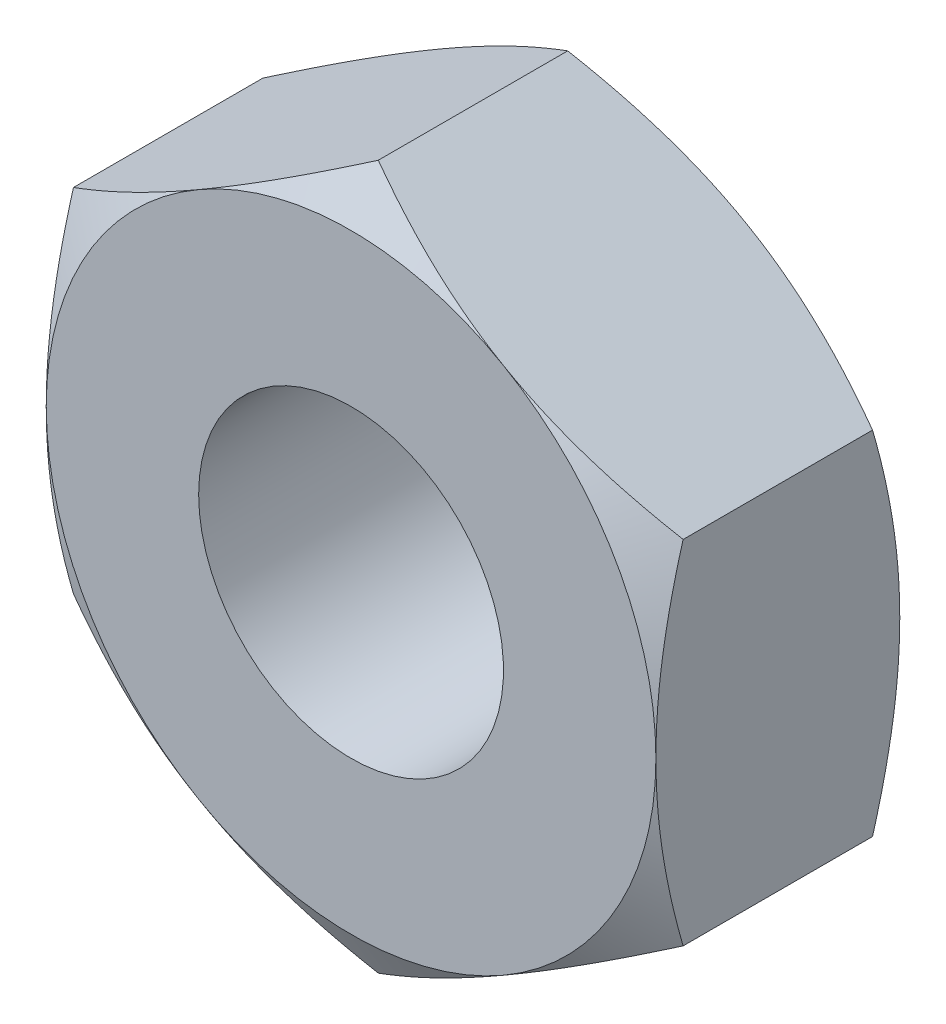
ISO-10303-21;
HEADER;
FILE_DESCRIPTION(('STEP AP214'),'2;1');
FILE_NAME('part.step','',(''),(''),'','','');
FILE_SCHEMA(('AUTOMOTIVE_DESIGN { 1 0 10303 214 1 1 1 1 }'));
ENDSEC;
DATA;
#1=APPLICATION_CONTEXT('core data for automotive mechanical design processes');
#2=APPLICATION_PROTOCOL_DEFINITION('international standard','automotive_design',2000,#1);
#3=PRODUCT_CONTEXT('',#1,'mechanical');
#4=PRODUCT('Part','Part','',(#3));
#5=PRODUCT_RELATED_PRODUCT_CATEGORY('part','',(#4));
#6=PRODUCT_DEFINITION_FORMATION('','',#4);
#7=PRODUCT_DEFINITION_CONTEXT('part definition',#1,'design');
#8=PRODUCT_DEFINITION('design','',#6,#7);
#9=PRODUCT_DEFINITION_SHAPE('','',#8);
#10=(LENGTH_UNIT() NAMED_UNIT(*) SI_UNIT(.MILLI.,.METRE.));
#11=(NAMED_UNIT(*) PLANE_ANGLE_UNIT() SI_UNIT($,.RADIAN.));
#12=(NAMED_UNIT(*) SI_UNIT($,.STERADIAN.) SOLID_ANGLE_UNIT());
#13=UNCERTAINTY_MEASURE_WITH_UNIT(LENGTH_MEASURE(1.E-05),#10,'distance_accuracy_value','');
#14=(GEOMETRIC_REPRESENTATION_CONTEXT(3) GLOBAL_UNCERTAINTY_ASSIGNED_CONTEXT((#13)) GLOBAL_UNIT_ASSIGNED_CONTEXT((#10,
#11,#12)) REPRESENTATION_CONTEXT('',''));
#15=CARTESIAN_POINT('',(0.,0.,0.));
#16=DIRECTION('',(0.,0.,1.));
#17=DIRECTION('',(1.,0.,0.));
#18=AXIS2_PLACEMENT_3D('',#15,#16,#17);
#19=CARTESIAN_POINT('',(0.,2.3094010767585,0.8));
#20=DIRECTION('',(0.5,-0.866025403784438,0.));
#21=DIRECTION('',(0.866025403784439,0.5,0.));
#22=AXIS2_PLACEMENT_3D('',#19,#20,#21);
#23=PLANE('',#22);
#24=DIRECTION('',(0.,0.,-1.));
#25=VECTOR('',#24,1.);
#26=CARTESIAN_POINT('',(0.,2.3094010767585,0.8));
#27=LINE('',#26,#25);
#28=CARTESIAN_POINT('',(0.,2.3094010767585,0.621367205045919));
#29=VERTEX_POINT('',#28);
#30=CARTESIAN_POINT('',(0.,2.3094010767585,-0.621367205045919));
#31=VERTEX_POINT('',#30);
#32=EDGE_CURVE('E243',#29,#31,#27,.T.);
#33=ORIENTED_EDGE('',*,*,#32,.T.);
#34=CARTESIAN_POINT('',(0.000199999999999798,2.30951654681234,-0.621300533379502));
#35=CARTESIAN_POINT('',(-0.0876912629000602,2.25877250251758,-0.650610463899321));
#36=CARTESIAN_POINT('',(-0.176341194473591,2.20759044065996,-0.677267148019533));
#37=CARTESIAN_POINT('',(-0.355176246997802,2.10433997494456,-0.723797508979279));
#38=CARTESIAN_POINT('',(-0.445364546505036,2.0522697359463,-0.743654723617221));
#39=CARTESIAN_POINT('',(-0.624623385763306,1.94877459684592,-0.774566535976747));
#40=CARTESIAN_POINT('',(-0.713666338226304,1.89736562427197,-0.785826848401469));
#41=CARTESIAN_POINT('',(-0.892171397785043,1.79430568008402,-0.799271337405358));
#42=CARTESIAN_POINT('',(-0.981632855703958,1.74265508327244,-0.801466645046532));
#43=CARTESIAN_POINT('',(-1.1488083535488,1.64613626458981,-0.796909010669351));
#44=CARTESIAN_POINT('',(-1.22654737026578,1.60125362236172,-0.791275125312985));
#45=CARTESIAN_POINT('',(-1.38151891453613,1.51178075956051,-0.773416104739172));
#46=CARTESIAN_POINT('',(-1.4587509057412,1.46719084864821,-0.761184863976561));
#47=CARTESIAN_POINT('',(-1.6140421864822,1.37753338590959,-0.73060656313239));
#48=CARTESIAN_POINT('',(-1.69208181310738,1.33247718647009,-0.712129832934284));
#49=CARTESIAN_POINT('',(-1.84699686569213,1.24303693915875,-0.670194481787144));
#50=CARTESIAN_POINT('',(-1.92387427762312,1.1986517446858,-0.646745719507687));
#51=CARTESIAN_POINT('',(-2.0002,1.15458506832541,-0.621300533379503));
#52=B_SPLINE_CURVE_WITH_KNOTS('',3,(#34,#35,#36,#37,#38,#39,#40,#41,#42,#43,#44,#45,#46,#47,#48,
#49,#50,#51),.UNSPECIFIED.,.F.,.F.,(4,2,2,2,2,2,2,2,4),(0.,0.31703182469561,0.634825876346563,
0.944753967652636,1.25430138000371,1.52387047293094,1.79368946861028,2.06949491027634,
2.34475850821472),.UNSPECIFIED.);
#53=CARTESIAN_POINT('',(-1.,1.73205080756888,-0.8));
#54=VERTEX_POINT('',#53);
#55=EDGE_CURVE('E60',#31,#54,#52,.T.);
#56=ORIENTED_EDGE('',*,*,#55,.T.);
#57=CARTESIAN_POINT('',(-2.,1.15470053837925,-0.621367205045919));
#58=VERTEX_POINT('',#57);
#59=EDGE_CURVE('E178',#54,#58,#52,.T.);
#60=ORIENTED_EDGE('',*,*,#59,.T.);
#61=DIRECTION('',(0.,0.,-1.));
#62=VECTOR('',#61,1.);
#63=CARTESIAN_POINT('',(-2.,1.15470053837925,0.8));
#64=LINE('',#63,#62);
#65=CARTESIAN_POINT('',(-2.,1.15470053837925,0.621367205045919));
#66=VERTEX_POINT('',#65);
#67=EDGE_CURVE('E258',#66,#58,#64,.T.);
#68=ORIENTED_EDGE('',*,*,#67,.F.);
#69=CARTESIAN_POINT('',(0.000199999999999798,2.30951654681234,0.621300533379502));
#70=CARTESIAN_POINT('',(-0.0876912629000602,2.25877250251758,0.650610463899321));
#71=CARTESIAN_POINT('',(-0.176341194473591,2.20759044065996,0.677267148019533));
#72=CARTESIAN_POINT('',(-0.355176246997802,2.10433997494456,0.723797508979279));
#73=CARTESIAN_POINT('',(-0.445364546505036,2.0522697359463,0.743654723617221));
#74=CARTESIAN_POINT('',(-0.624623385763306,1.94877459684592,0.774566535976747));
#75=CARTESIAN_POINT('',(-0.713666338226304,1.89736562427197,0.785826848401469));
#76=CARTESIAN_POINT('',(-0.892171397785043,1.79430568008402,0.799271337405358));
#77=CARTESIAN_POINT('',(-0.981632855703958,1.74265508327244,0.801466645046532));
#78=CARTESIAN_POINT('',(-1.1488083535488,1.64613626458981,0.796909010669351));
#79=CARTESIAN_POINT('',(-1.22654737026578,1.60125362236172,0.791275125312985));
#80=CARTESIAN_POINT('',(-1.38151891453613,1.51178075956051,0.773416104739172));
#81=CARTESIAN_POINT('',(-1.4587509057412,1.46719084864821,0.761184863976561));
#82=CARTESIAN_POINT('',(-1.6140421864822,1.37753338590959,0.73060656313239));
#83=CARTESIAN_POINT('',(-1.69208181310738,1.33247718647009,0.712129832934284));
#84=CARTESIAN_POINT('',(-1.84699686569213,1.24303693915875,0.670194481787144));
#85=CARTESIAN_POINT('',(-1.92387427762312,1.1986517446858,0.646745719507687));
#86=CARTESIAN_POINT('',(-2.0002,1.15458506832541,0.621300533379503));
#87=B_SPLINE_CURVE_WITH_KNOTS('',3,(#69,#70,#71,#72,#73,#74,#75,#76,#77,#78,#79,#80,#81,#82,#83,
#84,#85,#86),.UNSPECIFIED.,.F.,.F.,(4,2,2,2,2,2,2,2,4),(0.,0.31703182469561,0.634825876346563,
0.944753967652636,1.25430138000371,1.52387047293094,1.79368946861028,2.06949491027634,
2.34475850821472),.UNSPECIFIED.);
#88=CARTESIAN_POINT('',(-1.,1.73205080756888,0.8));
#89=VERTEX_POINT('',#88);
#90=EDGE_CURVE('E234',#89,#66,#87,.T.);
#91=ORIENTED_EDGE('',*,*,#90,.F.);
#92=EDGE_CURVE('E239',#29,#89,#87,.T.);
#93=ORIENTED_EDGE('',*,*,#92,.F.);
#94=EDGE_LOOP('',(#33,#56,#60,#68,#91,#93));
#95=FACE_BOUND('',#94,.T.);
#96=ADVANCED_FACE('F38',(#95),#23,.F.);
#97=CARTESIAN_POINT('',(-2.,1.15470053837925,0.8));
#98=DIRECTION('',(1.,0.,0.));
#99=DIRECTION('',(0.,0.,-1.));
#100=AXIS2_PLACEMENT_3D('',#97,#98,#99);
#101=PLANE('',#100);
#102=ORIENTED_EDGE('',*,*,#67,.T.);
#103=CARTESIAN_POINT('',(-2.,-3.14946280755068,0.199296983759909));
#104=CARTESIAN_POINT('',(-2.,-3.06168654922102,0.156527633574789));
#105=CARTESIAN_POINT('',(-2.,-2.9737138337997,0.114154813917838));
#106=CARTESIAN_POINT('',(-2.,-2.79727116970519,0.030424371454318));
#107=CARTESIAN_POINT('',(-2.,-2.70880114935967,-0.0109331001558542));
#108=CARTESIAN_POINT('',(-2.,-2.53082636976171,-0.0926086106809137));
#109=CARTESIAN_POINT('',(-2.,-2.44131862529228,-0.132920166328585));
#110=CARTESIAN_POINT('',(-2.,-2.2616076272172,-0.211955914656171));
#111=CARTESIAN_POINT('',(-2.,-2.17140440536949,-0.250680179313292));
#112=CARTESIAN_POINT('',(-2.,-1.98708288008165,-0.327404252129081));
#113=CARTESIAN_POINT('',(-2.,-1.89293561513795,-0.365334850952447));
#114=CARTESIAN_POINT('',(-2.,-1.70357591703192,-0.43843181928538));
#115=CARTESIAN_POINT('',(-2.,-1.60836357685199,-0.473598427976315));
#116=CARTESIAN_POINT('',(-2.,-1.41685790895819,-0.540290890905273));
#117=CARTESIAN_POINT('',(-2.,-1.320566911767,-0.57182337201251));
#118=CARTESIAN_POINT('',(-2.,-1.12660452014373,-0.630263659771523));
#119=CARTESIAN_POINT('',(-2.,-1.02893355536647,-0.657172872979496));
#120=CARTESIAN_POINT('',(-2.,-0.832695758594131,-0.704964094758886));
#121=CARTESIAN_POINT('',(-2.,-0.734137289636661,-0.725879820646293));
#122=CARTESIAN_POINT('',(-2.,-0.535747119692847,-0.760533678381679));
#123=CARTESIAN_POINT('',(-2.,-0.435915558376126,-0.774272590767447));
#124=CARTESIAN_POINT('',(-2.,-0.236796947507614,-0.793295884851828));
#125=CARTESIAN_POINT('',(-2.,-0.137520950727669,-0.798692682024138));
#126=CARTESIAN_POINT('',(-2.,0.0611248179394518,-0.800886152746221));
#127=CARTESIAN_POINT('',(-2.,0.16049459118763,-0.797682699498088));
#128=CARTESIAN_POINT('',(-2.,0.39605143432105,-0.780167134410027));
#129=CARTESIAN_POINT('',(-2.,0.531962961475725,-0.76211500356186));
#130=CARTESIAN_POINT('',(-2.,0.80140273308676,-0.712957702638607));
#131=CARTESIAN_POINT('',(-2.,0.934928711498219,-0.681840744950384));
#132=CARTESIAN_POINT('',(-2.,1.20240583468696,-0.60915176800854));
#133=CARTESIAN_POINT('',(-2.,1.33629332548302,-0.567351384200116));
#134=CARTESIAN_POINT('',(-2.,1.53524627173162,-0.499348947851221));
#135=CARTESIAN_POINT('',(-2.,1.60124601940686,-0.475799779778384));
#136=CARTESIAN_POINT('',(-2.,1.73269428220977,-0.427210441126342));
#137=CARTESIAN_POINT('',(-2.,1.79814280996152,-0.402170304799949));
#138=CARTESIAN_POINT('',(-2.,1.97439415181046,-0.332807074194357));
#139=CARTESIAN_POINT('',(-2.,2.08473168532286,-0.287304517647802));
#140=CARTESIAN_POINT('',(-2.,2.30426835470115,-0.193621613740496));
#141=CARTESIAN_POINT('',(-2.,2.41346736638969,-0.14544097783896));
#142=CARTESIAN_POINT('',(-2.,2.63098527942082,-0.0470392184536771));
#143=CARTESIAN_POINT('',(-2.,2.73930385715561,0.00318261789643134));
#144=CARTESIAN_POINT('',(-2.,2.95520524950209,0.105186581117957));
#145=CARTESIAN_POINT('',(-2.,3.06278804153026,0.156968755619608));
#146=CARTESIAN_POINT('',(-2.,3.38499028481645,0.314286397889381));
#147=CARTESIAN_POINT('',(-2.,3.59872280328008,0.421635968339488));
#148=CARTESIAN_POINT('',(-2.,4.02457125625417,0.639362411589059));
#149=CARTESIAN_POINT('',(-2.,4.23668752151103,0.749738642533589));
#150=CARTESIAN_POINT('',(-2.,4.63740849005678,0.960750287234702));
#151=CARTESIAN_POINT('',(-2.,4.82612256813429,1.06117835067173));
#152=CARTESIAN_POINT('',(-2.,5.20291659711028,1.26324301092442));
#153=CARTESIAN_POINT('',(-2.,5.39099650789844,1.36487968240862));
#154=CARTESIAN_POINT('',(-2.,5.76603621826712,1.56870541402304));
#155=CARTESIAN_POINT('',(-2.,5.95299765701286,1.67089146165099));
#156=CARTESIAN_POINT('',(-2.,6.32652448829288,1.87595012800608));
#157=CARTESIAN_POINT('',(-2.,6.51308991107919,1.97882269160472));
#158=CARTESIAN_POINT('',(-2.,6.69951629242091,2.08194487385819));
#159=B_SPLINE_CURVE_WITH_KNOTS('',3,(#103,#104,#105,#106,#107,#108,#109,#110,#111,#112,#113,
#114,#115,#116,#117,#118,#119,#120,#121,#122,#123,#124,#125,#126,#127,#128,#129,#130,#131,#132,
#133,#134,#135,#136,#137,#138,#139,#140,#141,#142,#143,#144,#145,#146,#147,#148,#149,#150,#151,
#152,#153,#154,#155,#156,#157,#158),.UNSPECIFIED.,.F.,.F.,(4,2,2,2,2,2,2,2,2,2,2,2,2,2,2,2,2,2,
2,2,2,2,2,2,2,2,2,4),(0.,0.292928260881487,0.585899880597929,0.880386954426177,1.17486065965382,
1.47933002200259,1.78377300807745,2.08765174859075,2.39143787445936,2.69347985595588,
2.99548898104746,3.29339171616201,3.59129884343364,4.00176919714359,4.4126106922864,
4.83310033596865,5.04331380141562,5.25352243937825,5.6115261819389,5.96956857147549,
6.32773709623028,6.68591656538681,7.40340089318721,8.12073422530671,8.76204652808672,
9.40339865953487,10.0425911580078,10.6817329313965),.UNSPECIFIED.);
#160=CARTESIAN_POINT('',(-2.,0.,-0.8));
#161=VERTEX_POINT('',#160);
#162=EDGE_CURVE('E326',#58,#161,#159,.F.);
#163=ORIENTED_EDGE('',*,*,#162,.T.);
#164=CARTESIAN_POINT('',(-2.,-1.15470053837925,-0.621367205045919));
#165=VERTEX_POINT('',#164);
#166=EDGE_CURVE('E201',#161,#165,#159,.F.);
#167=ORIENTED_EDGE('',*,*,#166,.T.);
#168=DIRECTION('',(0.,0.,-1.));
#169=VECTOR('',#168,1.);
#170=CARTESIAN_POINT('',(-2.,-1.15470053837925,0.8));
#171=LINE('',#170,#169);
#172=CARTESIAN_POINT('',(-2.,-1.15470053837925,0.621367205045919));
#173=VERTEX_POINT('',#172);
#174=EDGE_CURVE('E255',#173,#165,#171,.T.);
#175=ORIENTED_EDGE('',*,*,#174,.F.);
#176=CARTESIAN_POINT('',(-2.,-3.14946280755068,-0.199296983759909));
#177=CARTESIAN_POINT('',(-2.,-3.06168654922102,-0.156527633574789));
#178=CARTESIAN_POINT('',(-2.,-2.9737138337997,-0.114154813917838));
#179=CARTESIAN_POINT('',(-2.,-2.79727116970519,-0.030424371454318));
#180=CARTESIAN_POINT('',(-2.,-2.70880114935967,0.0109331001558542));
#181=CARTESIAN_POINT('',(-2.,-2.53082636976171,0.0926086106809137));
#182=CARTESIAN_POINT('',(-2.,-2.44131862529228,0.132920166328585));
#183=CARTESIAN_POINT('',(-2.,-2.2616076272172,0.211955914656171));
#184=CARTESIAN_POINT('',(-2.,-2.17140440536949,0.250680179313292));
#185=CARTESIAN_POINT('',(-2.,-1.98708288008165,0.327404252129081));
#186=CARTESIAN_POINT('',(-2.,-1.89293561513795,0.365334850952447));
#187=CARTESIAN_POINT('',(-2.,-1.70357591703192,0.43843181928538));
#188=CARTESIAN_POINT('',(-2.,-1.60836357685199,0.473598427976315));
#189=CARTESIAN_POINT('',(-2.,-1.41685790895819,0.540290890905273));
#190=CARTESIAN_POINT('',(-2.,-1.320566911767,0.57182337201251));
#191=CARTESIAN_POINT('',(-2.,-1.12660452014373,0.630263659771523));
#192=CARTESIAN_POINT('',(-2.,-1.02893355536647,0.657172872979496));
#193=CARTESIAN_POINT('',(-2.,-0.832695758594131,0.704964094758886));
#194=CARTESIAN_POINT('',(-2.,-0.734137289636661,0.725879820646293));
#195=CARTESIAN_POINT('',(-2.,-0.535747119692847,0.760533678381679));
#196=CARTESIAN_POINT('',(-2.,-0.435915558376126,0.774272590767447));
#197=CARTESIAN_POINT('',(-2.,-0.236796947507614,0.793295884851828));
#198=CARTESIAN_POINT('',(-2.,-0.137520950727669,0.798692682024138));
#199=CARTESIAN_POINT('',(-2.,0.0611248179394518,0.800886152746221));
#200=CARTESIAN_POINT('',(-2.,0.16049459118763,0.797682699498088));
#201=CARTESIAN_POINT('',(-2.,0.39605143432105,0.780167134410027));
#202=CARTESIAN_POINT('',(-2.,0.531962961475725,0.76211500356186));
#203=CARTESIAN_POINT('',(-2.,0.80140273308676,0.712957702638607));
#204=CARTESIAN_POINT('',(-2.,0.934928711498219,0.681840744950384));
#205=CARTESIAN_POINT('',(-2.,1.20240583468696,0.60915176800854));
#206=CARTESIAN_POINT('',(-2.,1.33629332548302,0.567351384200116));
#207=CARTESIAN_POINT('',(-2.,1.53524627173162,0.499348947851221));
#208=CARTESIAN_POINT('',(-2.,1.60124601940686,0.475799779778384));
#209=CARTESIAN_POINT('',(-2.,1.73269428220977,0.427210441126342));
#210=CARTESIAN_POINT('',(-2.,1.79814280996152,0.402170304799949));
#211=CARTESIAN_POINT('',(-2.,1.97439415181046,0.332807074194357));
#212=CARTESIAN_POINT('',(-2.,2.08473168532286,0.287304517647802));
#213=CARTESIAN_POINT('',(-2.,2.30426835470115,0.193621613740496));
#214=CARTESIAN_POINT('',(-2.,2.41346736638969,0.14544097783896));
#215=CARTESIAN_POINT('',(-2.,2.63098527942082,0.0470392184536771));
#216=CARTESIAN_POINT('',(-2.,2.73930385715561,-0.00318261789643134));
#217=CARTESIAN_POINT('',(-2.,2.95520524950209,-0.105186581117957));
#218=CARTESIAN_POINT('',(-2.,3.06278804153026,-0.156968755619608));
#219=CARTESIAN_POINT('',(-2.,3.38499028481645,-0.314286397889381));
#220=CARTESIAN_POINT('',(-2.,3.59872280328008,-0.421635968339488));
#221=CARTESIAN_POINT('',(-2.,4.02457125625417,-0.639362411589059));
#222=CARTESIAN_POINT('',(-2.,4.23668752151103,-0.749738642533589));
#223=CARTESIAN_POINT('',(-2.,4.63740849005678,-0.960750287234702));
#224=CARTESIAN_POINT('',(-2.,4.82612256813429,-1.06117835067173));
#225=CARTESIAN_POINT('',(-2.,5.20291659711028,-1.26324301092442));
#226=CARTESIAN_POINT('',(-2.,5.39099650789844,-1.36487968240862));
#227=CARTESIAN_POINT('',(-2.,5.76603621826712,-1.56870541402304));
#228=CARTESIAN_POINT('',(-2.,5.95299765701286,-1.67089146165099));
#229=CARTESIAN_POINT('',(-2.,6.32652448829288,-1.87595012800608));
#230=CARTESIAN_POINT('',(-2.,6.51308991107919,-1.97882269160472));
#231=CARTESIAN_POINT('',(-2.,6.69951629242091,-2.08194487385819));
#232=B_SPLINE_CURVE_WITH_KNOTS('',3,(#176,#177,#178,#179,#180,#181,#182,#183,#184,#185,#186,
#187,#188,#189,#190,#191,#192,#193,#194,#195,#196,#197,#198,#199,#200,#201,#202,#203,#204,#205,
#206,#207,#208,#209,#210,#211,#212,#213,#214,#215,#216,#217,#218,#219,#220,#221,#222,#223,#224,
#225,#226,#227,#228,#229,#230,#231),.UNSPECIFIED.,.F.,.F.,(4,2,2,2,2,2,2,2,2,2,2,2,2,2,2,2,2,2,
2,2,2,2,2,2,2,2,2,4),(0.,0.292928260881487,0.585899880597929,0.880386954426177,1.17486065965382,
1.47933002200259,1.78377300807745,2.08765174859075,2.39143787445936,2.69347985595588,
2.99548898104746,3.29339171616201,3.59129884343364,4.00176919714359,4.4126106922864,
4.83310033596865,5.04331380141562,5.25352243937825,5.6115261819389,5.96956857147549,
6.32773709623028,6.68591656538681,7.40340089318721,8.12073422530671,8.76204652808672,
9.40339865953487,10.0425911580078,10.6817329313965),.UNSPECIFIED.);
#233=CARTESIAN_POINT('',(-2.,0.,0.8));
#234=VERTEX_POINT('',#233);
#235=EDGE_CURVE('E228',#234,#173,#232,.F.);
#236=ORIENTED_EDGE('',*,*,#235,.F.);
#237=EDGE_CURVE('E233',#66,#234,#232,.F.);
#238=ORIENTED_EDGE('',*,*,#237,.F.);
#239=EDGE_LOOP('',(#102,#163,#167,#175,#236,#238));
#240=FACE_BOUND('',#239,.T.);
#241=ADVANCED_FACE('F209',(#240),#101,.F.);
#242=CARTESIAN_POINT('',(-2.,-1.15470053837925,0.8));
#243=DIRECTION('',(0.5,0.866025403784439,0.));
#244=DIRECTION('',(-0.866025403784439,0.5,0.));
#245=AXIS2_PLACEMENT_3D('',#242,#243,#244);
#246=PLANE('',#245);
#247=ORIENTED_EDGE('',*,*,#174,.T.);
#248=CARTESIAN_POINT('',(-2.0002,-1.15458506832541,-0.621300533379502));
#249=CARTESIAN_POINT('',(-1.91230873709994,-1.20532911262018,-0.650610463899321));
#250=CARTESIAN_POINT('',(-1.82365880552641,-1.2565111744778,-0.677267148019533));
#251=CARTESIAN_POINT('',(-1.6448237530022,-1.35976164019319,-0.723797508979279));
#252=CARTESIAN_POINT('',(-1.55463545349496,-1.41183187919145,-0.743654723617221));
#253=CARTESIAN_POINT('',(-1.37537661423669,-1.51532701829183,-0.774566535976747));
#254=CARTESIAN_POINT('',(-1.2863336617737,-1.56673599086578,-0.785826848401469));
#255=CARTESIAN_POINT('',(-1.10782860221496,-1.66979593505373,-0.799271337405358));
#256=CARTESIAN_POINT('',(-1.01836714429604,-1.72144653186531,-0.801466645046532));
#257=CARTESIAN_POINT('',(-0.851191646451202,-1.81796535054794,-0.796909010669351));
#258=CARTESIAN_POINT('',(-0.773452629734216,-1.86284799277603,-0.791275125312985));
#259=CARTESIAN_POINT('',(-0.618481085463866,-1.95232085557725,-0.773416104739171));
#260=CARTESIAN_POINT('',(-0.541249094258801,-1.99691076648954,-0.76118486397656));
#261=CARTESIAN_POINT('',(-0.385957813517799,-2.08656822922816,-0.73060656313239));
#262=CARTESIAN_POINT('',(-0.30791818689262,-2.13162442866767,-0.712129832934284));
#263=CARTESIAN_POINT('',(-0.153003134307864,-2.221064675979,-0.670194481787144));
#264=CARTESIAN_POINT('',(-0.076125722376879,-2.26544987045196,-0.646745719507687));
#265=CARTESIAN_POINT('',(0.000200000000001062,-2.30951654681234,-0.621300533379502));
#266=B_SPLINE_CURVE_WITH_KNOTS('',3,(#248,#249,#250,#251,#252,#253,#254,#255,#256,#257,#258,
#259,#260,#261,#262,#263,#264,#265),.UNSPECIFIED.,.F.,.F.,(4,2,2,2,2,2,2,2,4),(0.,
0.31703182469561,0.634825876346563,0.944753967652636,1.25430138000371,1.52387047293094,
1.79368946861028,2.06949491027634,2.34475850821472),.UNSPECIFIED.);
#267=CARTESIAN_POINT('',(-1.,-1.73205080756888,-0.8));
#268=VERTEX_POINT('',#267);
#269=EDGE_CURVE('E199',#165,#268,#266,.T.);
#270=ORIENTED_EDGE('',*,*,#269,.T.);
#271=CARTESIAN_POINT('',(0.,-2.3094010767585,-0.621367205045919));
#272=VERTEX_POINT('',#271);
#273=EDGE_CURVE('E193',#268,#272,#266,.T.);
#274=ORIENTED_EDGE('',*,*,#273,.T.);
#275=DIRECTION('',(0.,0.,-1.));
#276=VECTOR('',#275,1.);
#277=CARTESIAN_POINT('',(0.,-2.3094010767585,0.8));
#278=LINE('',#277,#276);
#279=CARTESIAN_POINT('',(0.,-2.3094010767585,0.621367205045919));
#280=VERTEX_POINT('',#279);
#281=EDGE_CURVE('E252',#280,#272,#278,.T.);
#282=ORIENTED_EDGE('',*,*,#281,.F.);
#283=CARTESIAN_POINT('',(-2.0002,-1.15458506832541,0.621300533379502));
#284=CARTESIAN_POINT('',(-1.91230873709994,-1.20532911262018,0.650610463899321));
#285=CARTESIAN_POINT('',(-1.82365880552641,-1.2565111744778,0.677267148019533));
#286=CARTESIAN_POINT('',(-1.6448237530022,-1.35976164019319,0.723797508979279));
#287=CARTESIAN_POINT('',(-1.55463545349496,-1.41183187919145,0.743654723617221));
#288=CARTESIAN_POINT('',(-1.37537661423669,-1.51532701829183,0.774566535976747));
#289=CARTESIAN_POINT('',(-1.2863336617737,-1.56673599086578,0.785826848401469));
#290=CARTESIAN_POINT('',(-1.10782860221496,-1.66979593505373,0.799271337405358));
#291=CARTESIAN_POINT('',(-1.01836714429604,-1.72144653186531,0.801466645046532));
#292=CARTESIAN_POINT('',(-0.851191646451202,-1.81796535054794,0.796909010669351));
#293=CARTESIAN_POINT('',(-0.773452629734216,-1.86284799277603,0.791275125312985));
#294=CARTESIAN_POINT('',(-0.618481085463866,-1.95232085557725,0.773416104739171));
#295=CARTESIAN_POINT('',(-0.541249094258801,-1.99691076648954,0.76118486397656));
#296=CARTESIAN_POINT('',(-0.385957813517799,-2.08656822922816,0.73060656313239));
#297=CARTESIAN_POINT('',(-0.30791818689262,-2.13162442866767,0.712129832934284));
#298=CARTESIAN_POINT('',(-0.153003134307864,-2.221064675979,0.670194481787144));
#299=CARTESIAN_POINT('',(-0.076125722376879,-2.26544987045196,0.646745719507687));
#300=CARTESIAN_POINT('',(0.000200000000001062,-2.30951654681234,0.621300533379502));
#301=B_SPLINE_CURVE_WITH_KNOTS('',3,(#283,#284,#285,#286,#287,#288,#289,#290,#291,#292,#293,
#294,#295,#296,#297,#298,#299,#300),.UNSPECIFIED.,.F.,.F.,(4,2,2,2,2,2,2,2,4),(0.,
0.31703182469561,0.634825876346563,0.944753967652636,1.25430138000371,1.52387047293094,
1.79368946861028,2.06949491027634,2.34475850821472),.UNSPECIFIED.);
#302=CARTESIAN_POINT('',(-1.,-1.73205080756888,0.8));
#303=VERTEX_POINT('',#302);
#304=EDGE_CURVE('E215',#303,#280,#301,.T.);
#305=ORIENTED_EDGE('',*,*,#304,.F.);
#306=EDGE_CURVE('E221',#173,#303,#301,.T.);
#307=ORIENTED_EDGE('',*,*,#306,.F.);
#308=EDGE_LOOP('',(#247,#270,#274,#282,#305,#307));
#309=FACE_BOUND('',#308,.T.);
#310=ADVANCED_FACE('F205',(#309),#246,.F.);
#311=CARTESIAN_POINT('',(0.,-2.3094010767585,0.8));
#312=DIRECTION('',(-0.5,0.866025403784438,0.));
#313=DIRECTION('',(-0.866025403784438,-0.5,0.));
#314=AXIS2_PLACEMENT_3D('',#311,#312,#313);
#315=PLANE('',#314);
#316=ORIENTED_EDGE('',*,*,#281,.T.);
#317=CARTESIAN_POINT('',(-0.000199999999999386,-2.30951654681234,-0.621300533379502));
#318=CARTESIAN_POINT('',(0.0876912629000605,-2.25877250251758,-0.650610463899321));
#319=CARTESIAN_POINT('',(0.176341194473592,-2.20759044065996,-0.677267148019533));
#320=CARTESIAN_POINT('',(0.355176246997802,-2.10433997494456,-0.723797508979279));
#321=CARTESIAN_POINT('',(0.445364546505037,-2.05226973594631,-0.743654723617221));
#322=CARTESIAN_POINT('',(0.624623385763306,-1.94877459684592,-0.774566535976747));
#323=CARTESIAN_POINT('',(0.713666338226304,-1.89736562427197,-0.785826848401469));
#324=CARTESIAN_POINT('',(0.892171397785043,-1.79430568008402,-0.799271337405358));
#325=CARTESIAN_POINT('',(0.981632855703958,-1.74265508327244,-0.801466645046532));
#326=CARTESIAN_POINT('',(1.1488083535488,-1.64613626458981,-0.796909010669351));
#327=CARTESIAN_POINT('',(1.22654737026578,-1.60125362236173,-0.791275125312985));
#328=CARTESIAN_POINT('',(1.38151891453613,-1.51178075956051,-0.773416104739172));
#329=CARTESIAN_POINT('',(1.4587509057412,-1.46719084864821,-0.761184863976561));
#330=CARTESIAN_POINT('',(1.6140421864822,-1.37753338590959,-0.73060656313239));
#331=CARTESIAN_POINT('',(1.69208181310738,-1.33247718647009,-0.712129832934284));
#332=CARTESIAN_POINT('',(1.84699686569213,-1.24303693915875,-0.670194481787144));
#333=CARTESIAN_POINT('',(1.92387427762312,-1.1986517446858,-0.646745719507687));
#334=CARTESIAN_POINT('',(2.0002,-1.15458506832541,-0.621300533379503));
#335=B_SPLINE_CURVE_WITH_KNOTS('',3,(#317,#318,#319,#320,#321,#322,#323,#324,#325,#326,#327,
#328,#329,#330,#331,#332,#333,#334),.UNSPECIFIED.,.F.,.F.,(4,2,2,2,2,2,2,2,4),(0.,
0.31703182469561,0.634825876346563,0.944753967652636,1.25430138000371,1.52387047293094,
1.79368946861028,2.06949491027634,2.34475850821472),.UNSPECIFIED.);
#336=CARTESIAN_POINT('',(1.,-1.73205080756888,-0.8));
#337=VERTEX_POINT('',#336);
#338=EDGE_CURVE('E200',#272,#337,#335,.T.);
#339=ORIENTED_EDGE('',*,*,#338,.T.);
#340=CARTESIAN_POINT('',(2.,-1.15470053837934,-0.621367205045981));
#341=VERTEX_POINT('',#340);
#342=EDGE_CURVE('E187',#337,#341,#335,.T.);
#343=ORIENTED_EDGE('',*,*,#342,.T.);
#344=DIRECTION('',(0.,0.,-1.));
#345=VECTOR('',#344,1.);
#346=CARTESIAN_POINT('',(2.,-1.15470053837925,0.8));
#347=LINE('',#346,#345);
#348=CARTESIAN_POINT('',(2.,-1.15470053837934,0.621367205045981));
#349=VERTEX_POINT('',#348);
#350=EDGE_CURVE('E249',#349,#341,#347,.T.);
#351=ORIENTED_EDGE('',*,*,#350,.F.);
#352=CARTESIAN_POINT('',(-0.000199999999999386,-2.30951654681234,0.621300533379502));
#353=CARTESIAN_POINT('',(0.0876912629000605,-2.25877250251758,0.650610463899321));
#354=CARTESIAN_POINT('',(0.176341194473592,-2.20759044065996,0.677267148019533));
#355=CARTESIAN_POINT('',(0.355176246997802,-2.10433997494456,0.723797508979279));
#356=CARTESIAN_POINT('',(0.445364546505037,-2.05226973594631,0.743654723617221));
#357=CARTESIAN_POINT('',(0.624623385763306,-1.94877459684592,0.774566535976747));
#358=CARTESIAN_POINT('',(0.713666338226304,-1.89736562427197,0.785826848401469));
#359=CARTESIAN_POINT('',(0.892171397785043,-1.79430568008402,0.799271337405358));
#360=CARTESIAN_POINT('',(0.981632855703958,-1.74265508327244,0.801466645046532));
#361=CARTESIAN_POINT('',(1.1488083535488,-1.64613626458981,0.796909010669351));
#362=CARTESIAN_POINT('',(1.22654737026578,-1.60125362236173,0.791275125312985));
#363=CARTESIAN_POINT('',(1.38151891453613,-1.51178075956051,0.773416104739172));
#364=CARTESIAN_POINT('',(1.4587509057412,-1.46719084864821,0.761184863976561));
#365=CARTESIAN_POINT('',(1.6140421864822,-1.37753338590959,0.73060656313239));
#366=CARTESIAN_POINT('',(1.69208181310738,-1.33247718647009,0.712129832934284));
#367=CARTESIAN_POINT('',(1.84699686569213,-1.24303693915875,0.670194481787144));
#368=CARTESIAN_POINT('',(1.92387427762312,-1.1986517446858,0.646745719507687));
#369=CARTESIAN_POINT('',(2.0002,-1.15458506832541,0.621300533379503));
#370=B_SPLINE_CURVE_WITH_KNOTS('',3,(#352,#353,#354,#355,#356,#357,#358,#359,#360,#361,#362,
#363,#364,#365,#366,#367,#368,#369),.UNSPECIFIED.,.F.,.F.,(4,2,2,2,2,2,2,2,4),(0.,
0.31703182469561,0.634825876346563,0.944753967652636,1.25430138000371,1.52387047293094,
1.79368946861028,2.06949491027634,2.34475850821472),.UNSPECIFIED.);
#371=CARTESIAN_POINT('',(1.,-1.73205080756888,0.8));
#372=VERTEX_POINT('',#371);
#373=EDGE_CURVE('E223',#372,#349,#370,.T.);
#374=ORIENTED_EDGE('',*,*,#373,.F.);
#375=EDGE_CURVE('E222',#280,#372,#370,.T.);
#376=ORIENTED_EDGE('',*,*,#375,.F.);
#377=EDGE_LOOP('',(#316,#339,#343,#351,#374,#376));
#378=FACE_BOUND('',#377,.T.);
#379=ADVANCED_FACE('F208',(#378),#315,.F.);
#380=CARTESIAN_POINT('',(2.,-1.15470053837925,0.8));
#381=DIRECTION('',(-1.,0.,0.));
#382=DIRECTION('',(0.,0.,1.));
#383=AXIS2_PLACEMENT_3D('',#380,#381,#382);
#384=PLANE('',#383);
#385=ORIENTED_EDGE('',*,*,#350,.T.);
#386=CARTESIAN_POINT('',(2.,-3.14946280755068,0.199296983759909));
#387=CARTESIAN_POINT('',(2.,-3.06168654922102,0.156527633574788));
#388=CARTESIAN_POINT('',(2.,-2.9737138337997,0.114154813917838));
#389=CARTESIAN_POINT('',(2.,-2.79727116970519,0.030424371454318));
#390=CARTESIAN_POINT('',(2.,-2.70880114935967,-0.0109331001558541));
#391=CARTESIAN_POINT('',(2.,-2.53082636976171,-0.0926086106809137));
#392=CARTESIAN_POINT('',(2.,-2.44131862529228,-0.132920166328585));
#393=CARTESIAN_POINT('',(2.,-2.2616076272172,-0.211955914656171));
#394=CARTESIAN_POINT('',(2.,-2.17140440536949,-0.250680179313292));
#395=CARTESIAN_POINT('',(2.,-1.98708288008165,-0.327404252129081));
#396=CARTESIAN_POINT('',(2.,-1.89293561513795,-0.365334850952447));
#397=CARTESIAN_POINT('',(2.,-1.70357591703192,-0.43843181928538));
#398=CARTESIAN_POINT('',(2.,-1.60836357685199,-0.473598427976315));
#399=CARTESIAN_POINT('',(2.,-1.41685790895819,-0.540290890905273));
#400=CARTESIAN_POINT('',(2.,-1.320566911767,-0.57182337201251));
#401=CARTESIAN_POINT('',(2.,-1.12660452014373,-0.630263659771523));
#402=CARTESIAN_POINT('',(2.,-1.02893355536647,-0.657172872979497));
#403=CARTESIAN_POINT('',(2.,-0.832695758594131,-0.704964094758886));
#404=CARTESIAN_POINT('',(2.,-0.734137289636661,-0.725879820646293));
#405=CARTESIAN_POINT('',(2.,-0.535747119692846,-0.760533678381679));
#406=CARTESIAN_POINT('',(2.,-0.435915558376126,-0.774272590767447));
#407=CARTESIAN_POINT('',(2.,-0.236796947507614,-0.793295884851828));
#408=CARTESIAN_POINT('',(2.,-0.137520950727669,-0.798692682024138));
#409=CARTESIAN_POINT('',(2.,0.061124817939452,-0.800886152746221));
#410=CARTESIAN_POINT('',(2.,0.16049459118763,-0.797682699498088));
#411=CARTESIAN_POINT('',(2.,0.39605143432105,-0.780167134410027));
#412=CARTESIAN_POINT('',(2.,0.531962961475725,-0.76211500356186));
#413=CARTESIAN_POINT('',(2.,0.801402733086761,-0.712957702638607));
#414=CARTESIAN_POINT('',(2.,0.93492871149822,-0.681840744950384));
#415=CARTESIAN_POINT('',(2.,1.20240583468696,-0.60915176800854));
#416=CARTESIAN_POINT('',(2.,1.33629332548302,-0.567351384200116));
#417=CARTESIAN_POINT('',(2.,1.53524627173161,-0.499348947851221));
#418=CARTESIAN_POINT('',(2.,1.60124601940686,-0.475799779778384));
#419=CARTESIAN_POINT('',(2.,1.73269428220977,-0.427210441126342));
#420=CARTESIAN_POINT('',(2.,1.79814280996152,-0.402170304799949));
#421=CARTESIAN_POINT('',(2.,1.97439415181046,-0.332807074194357));
#422=CARTESIAN_POINT('',(2.,2.08473168532286,-0.287304517647802));
#423=CARTESIAN_POINT('',(2.,2.30426835470115,-0.193621613740495));
#424=CARTESIAN_POINT('',(2.,2.41346736638969,-0.14544097783896));
#425=CARTESIAN_POINT('',(2.,2.63098527942082,-0.0470392184536766));
#426=CARTESIAN_POINT('',(2.,2.73930385715561,0.00318261789643187));
#427=CARTESIAN_POINT('',(2.,2.95520524950209,0.105186581117957));
#428=CARTESIAN_POINT('',(2.,3.06278804153026,0.156968755619609));
#429=CARTESIAN_POINT('',(2.,3.38499028481645,0.314286397889382));
#430=CARTESIAN_POINT('',(2.,3.59872280328008,0.421635968339488));
#431=CARTESIAN_POINT('',(2.,4.02457125625417,0.639362411589059));
#432=CARTESIAN_POINT('',(2.,4.23668752151103,0.74973864253359));
#433=CARTESIAN_POINT('',(2.,4.63740849005678,0.960750287234702));
#434=CARTESIAN_POINT('',(2.,4.82612256813429,1.06117835067173));
#435=CARTESIAN_POINT('',(2.,5.20291659711028,1.26324301092442));
#436=CARTESIAN_POINT('',(2.,5.39099650789844,1.36487968240862));
#437=CARTESIAN_POINT('',(2.,5.76603621826712,1.56870541402305));
#438=CARTESIAN_POINT('',(2.,5.95299765701286,1.67089146165099));
#439=CARTESIAN_POINT('',(2.,6.32652448829288,1.87595012800608));
#440=CARTESIAN_POINT('',(2.,6.51308991107919,1.97882269160472));
#441=CARTESIAN_POINT('',(2.,6.69951629242091,2.08194487385819));
#442=B_SPLINE_CURVE_WITH_KNOTS('',3,(#386,#387,#388,#389,#390,#391,#392,#393,#394,#395,#396,
#397,#398,#399,#400,#401,#402,#403,#404,#405,#406,#407,#408,#409,#410,#411,#412,#413,#414,#415,
#416,#417,#418,#419,#420,#421,#422,#423,#424,#425,#426,#427,#428,#429,#430,#431,#432,#433,#434,
#435,#436,#437,#438,#439,#440,#441),.UNSPECIFIED.,.F.,.F.,(4,2,2,2,2,2,2,2,2,2,2,2,2,2,2,2,2,2,
2,2,2,2,2,2,2,2,2,4),(0.,0.292928260881486,0.585899880597929,0.880386954426176,1.17486065965382,
1.47933002200259,1.78377300807745,2.08765174859075,2.39143787445936,2.69347985595588,
2.99548898104746,3.29339171616201,3.59129884343364,4.00176919714359,4.4126106922864,
4.83310033596865,5.04331380141562,5.25352243937825,5.6115261819389,5.96956857147549,
6.32773709623028,6.68591656538681,7.40340089318721,8.12073422530671,8.76204652808672,
9.40339865953487,10.0425911580078,10.6817329313965),.UNSPECIFIED.);
#443=CARTESIAN_POINT('',(2.,0.,-0.8));
#444=VERTEX_POINT('',#443);
#445=EDGE_CURVE('E154',#341,#444,#442,.T.);
#446=ORIENTED_EDGE('',*,*,#445,.T.);
#447=CARTESIAN_POINT('',(2.,1.15470053837925,-0.621367205045919));
#448=VERTEX_POINT('',#447);
#449=EDGE_CURVE('E140',#444,#448,#442,.T.);
#450=ORIENTED_EDGE('',*,*,#449,.T.);
#451=DIRECTION('',(0.,0.,-1.));
#452=VECTOR('',#451,1.);
#453=CARTESIAN_POINT('',(2.,1.15470053837925,0.8));
#454=LINE('',#453,#452);
#455=CARTESIAN_POINT('',(2.,1.15470053837925,0.621367205045919));
#456=VERTEX_POINT('',#455);
#457=EDGE_CURVE('E153',#456,#448,#454,.T.);
#458=ORIENTED_EDGE('',*,*,#457,.F.);
#459=CARTESIAN_POINT('',(2.,-3.14946280755068,-0.199296983759909));
#460=CARTESIAN_POINT('',(2.,-3.06168654922102,-0.156527633574788));
#461=CARTESIAN_POINT('',(2.,-2.9737138337997,-0.114154813917838));
#462=CARTESIAN_POINT('',(2.,-2.79727116970519,-0.030424371454318));
#463=CARTESIAN_POINT('',(2.,-2.70880114935967,0.0109331001558541));
#464=CARTESIAN_POINT('',(2.,-2.53082636976171,0.0926086106809137));
#465=CARTESIAN_POINT('',(2.,-2.44131862529228,0.132920166328585));
#466=CARTESIAN_POINT('',(2.,-2.2616076272172,0.211955914656171));
#467=CARTESIAN_POINT('',(2.,-2.17140440536949,0.250680179313292));
#468=CARTESIAN_POINT('',(2.,-1.98708288008165,0.327404252129081));
#469=CARTESIAN_POINT('',(2.,-1.89293561513795,0.365334850952447));
#470=CARTESIAN_POINT('',(2.,-1.70357591703192,0.43843181928538));
#471=CARTESIAN_POINT('',(2.,-1.60836357685199,0.473598427976315));
#472=CARTESIAN_POINT('',(2.,-1.41685790895819,0.540290890905273));
#473=CARTESIAN_POINT('',(2.,-1.320566911767,0.57182337201251));
#474=CARTESIAN_POINT('',(2.,-1.12660452014373,0.630263659771523));
#475=CARTESIAN_POINT('',(2.,-1.02893355536647,0.657172872979497));
#476=CARTESIAN_POINT('',(2.,-0.832695758594131,0.704964094758886));
#477=CARTESIAN_POINT('',(2.,-0.734137289636661,0.725879820646293));
#478=CARTESIAN_POINT('',(2.,-0.535747119692846,0.760533678381679));
#479=CARTESIAN_POINT('',(2.,-0.435915558376126,0.774272590767447));
#480=CARTESIAN_POINT('',(2.,-0.236796947507614,0.793295884851828));
#481=CARTESIAN_POINT('',(2.,-0.137520950727669,0.798692682024138));
#482=CARTESIAN_POINT('',(2.,0.061124817939452,0.800886152746221));
#483=CARTESIAN_POINT('',(2.,0.16049459118763,0.797682699498088));
#484=CARTESIAN_POINT('',(2.,0.39605143432105,0.780167134410027));
#485=CARTESIAN_POINT('',(2.,0.531962961475725,0.76211500356186));
#486=CARTESIAN_POINT('',(2.,0.801402733086761,0.712957702638607));
#487=CARTESIAN_POINT('',(2.,0.93492871149822,0.681840744950384));
#488=CARTESIAN_POINT('',(2.,1.20240583468696,0.60915176800854));
#489=CARTESIAN_POINT('',(2.,1.33629332548302,0.567351384200116));
#490=CARTESIAN_POINT('',(2.,1.53524627173161,0.499348947851221));
#491=CARTESIAN_POINT('',(2.,1.60124601940686,0.475799779778384));
#492=CARTESIAN_POINT('',(2.,1.73269428220977,0.427210441126342));
#493=CARTESIAN_POINT('',(2.,1.79814280996152,0.402170304799949));
#494=CARTESIAN_POINT('',(2.,1.97439415181046,0.332807074194357));
#495=CARTESIAN_POINT('',(2.,2.08473168532286,0.287304517647802));
#496=CARTESIAN_POINT('',(2.,2.30426835470115,0.193621613740495));
#497=CARTESIAN_POINT('',(2.,2.41346736638969,0.14544097783896));
#498=CARTESIAN_POINT('',(2.,2.63098527942082,0.0470392184536766));
#499=CARTESIAN_POINT('',(2.,2.73930385715561,-0.00318261789643187));
#500=CARTESIAN_POINT('',(2.,2.95520524950209,-0.105186581117957));
#501=CARTESIAN_POINT('',(2.,3.06278804153026,-0.156968755619609));
#502=CARTESIAN_POINT('',(2.,3.38499028481645,-0.314286397889382));
#503=CARTESIAN_POINT('',(2.,3.59872280328008,-0.421635968339488));
#504=CARTESIAN_POINT('',(2.,4.02457125625417,-0.639362411589059));
#505=CARTESIAN_POINT('',(2.,4.23668752151103,-0.74973864253359));
#506=CARTESIAN_POINT('',(2.,4.63740849005678,-0.960750287234702));
#507=CARTESIAN_POINT('',(2.,4.82612256813429,-1.06117835067173));
#508=CARTESIAN_POINT('',(2.,5.20291659711028,-1.26324301092442));
#509=CARTESIAN_POINT('',(2.,5.39099650789844,-1.36487968240862));
#510=CARTESIAN_POINT('',(2.,5.76603621826712,-1.56870541402305));
#511=CARTESIAN_POINT('',(2.,5.95299765701286,-1.67089146165099));
#512=CARTESIAN_POINT('',(2.,6.32652448829288,-1.87595012800608));
#513=CARTESIAN_POINT('',(2.,6.51308991107919,-1.97882269160472));
#514=CARTESIAN_POINT('',(2.,6.69951629242091,-2.08194487385819));
#515=B_SPLINE_CURVE_WITH_KNOTS('',3,(#459,#460,#461,#462,#463,#464,#465,#466,#467,#468,#469,
#470,#471,#472,#473,#474,#475,#476,#477,#478,#479,#480,#481,#482,#483,#484,#485,#486,#487,#488,
#489,#490,#491,#492,#493,#494,#495,#496,#497,#498,#499,#500,#501,#502,#503,#504,#505,#506,#507,
#508,#509,#510,#511,#512,#513,#514),.UNSPECIFIED.,.F.,.F.,(4,2,2,2,2,2,2,2,2,2,2,2,2,2,2,2,2,2,
2,2,2,2,2,2,2,2,2,4),(0.,0.292928260881486,0.585899880597929,0.880386954426176,1.17486065965382,
1.47933002200259,1.78377300807745,2.08765174859075,2.39143787445936,2.69347985595588,
2.99548898104746,3.29339171616201,3.59129884343364,4.00176919714359,4.4126106922864,
4.83310033596865,5.04331380141562,5.25352243937825,5.6115261819389,5.96956857147549,
6.32773709623028,6.68591656538681,7.40340089318721,8.12073422530671,8.76204652808672,
9.40339865953487,10.0425911580078,10.6817329313965),.UNSPECIFIED.);
#516=CARTESIAN_POINT('',(2.,0.,0.8));
#517=VERTEX_POINT('',#516);
#518=EDGE_CURVE('E295',#517,#456,#515,.T.);
#519=ORIENTED_EDGE('',*,*,#518,.F.);
#520=EDGE_CURVE('E291',#349,#517,#515,.T.);
#521=ORIENTED_EDGE('',*,*,#520,.F.);
#522=EDGE_LOOP('',(#385,#446,#450,#458,#519,#521));
#523=FACE_BOUND('',#522,.T.);
#524=ADVANCED_FACE('F305',(#523),#384,.F.);
#525=CARTESIAN_POINT('',(2.,1.15470053837925,0.8));
#526=DIRECTION('',(-0.5,-0.866025403784439,0.));
#527=DIRECTION('',(0.866025403784439,-0.5,0.));
#528=AXIS2_PLACEMENT_3D('',#525,#526,#527);
#529=PLANE('',#528);
#530=ORIENTED_EDGE('',*,*,#457,.T.);
#531=CARTESIAN_POINT('',(2.0002,1.15458506832541,-0.621300533379502));
#532=CARTESIAN_POINT('',(1.91230873709994,1.20532911262018,-0.650610463899321));
#533=CARTESIAN_POINT('',(1.82365880552641,1.2565111744778,-0.677267148019533));
#534=CARTESIAN_POINT('',(1.6448237530022,1.35976164019319,-0.723797508979279));
#535=CARTESIAN_POINT('',(1.55463545349496,1.41183187919145,-0.743654723617221));
#536=CARTESIAN_POINT('',(1.37537661423669,1.51532701829183,-0.774566535976747));
#537=CARTESIAN_POINT('',(1.2863336617737,1.56673599086578,-0.785826848401469));
#538=CARTESIAN_POINT('',(1.10782860221496,1.66979593505373,-0.799271337405358));
#539=CARTESIAN_POINT('',(1.01836714429604,1.72144653186531,-0.801466645046531));
#540=CARTESIAN_POINT('',(0.851191646451202,1.81796535054794,-0.796909010669351));
#541=CARTESIAN_POINT('',(0.773452629734216,1.86284799277603,-0.791275125312985));
#542=CARTESIAN_POINT('',(0.618481085463867,1.95232085557725,-0.773416104739171));
#543=CARTESIAN_POINT('',(0.541249094258801,1.99691076648954,-0.76118486397656));
#544=CARTESIAN_POINT('',(0.385957813517799,2.08656822922816,-0.73060656313239));
#545=CARTESIAN_POINT('',(0.30791818689262,2.13162442866767,-0.712129832934284));
#546=CARTESIAN_POINT('',(0.153003134307865,2.221064675979,-0.670194481787144));
#547=CARTESIAN_POINT('',(0.0761257223768795,2.26544987045196,-0.646745719507687));
#548=CARTESIAN_POINT('',(-0.000200000000000325,2.30951654681234,-0.621300533379502));
#549=B_SPLINE_CURVE_WITH_KNOTS('',3,(#531,#532,#533,#534,#535,#536,#537,#538,#539,#540,#541,
#542,#543,#544,#545,#546,#547,#548),.UNSPECIFIED.,.F.,.F.,(4,2,2,2,2,2,2,2,4),(0.,
0.31703182469561,0.634825876346563,0.944753967652636,1.25430138000371,1.52387047293094,
1.79368946861028,2.06949491027634,2.34475850821472),.UNSPECIFIED.);
#550=CARTESIAN_POINT('',(1.,1.73205080756888,-0.8));
#551=VERTEX_POINT('',#550);
#552=EDGE_CURVE('E133',#448,#551,#549,.T.);
#553=ORIENTED_EDGE('',*,*,#552,.T.);
#554=EDGE_CURVE('E124',#551,#31,#549,.T.);
#555=ORIENTED_EDGE('',*,*,#554,.T.);
#556=ORIENTED_EDGE('',*,*,#32,.F.);
#557=CARTESIAN_POINT('',(2.0002,1.15458506832541,0.621300533379502));
#558=CARTESIAN_POINT('',(1.91230873709994,1.20532911262018,0.650610463899321));
#559=CARTESIAN_POINT('',(1.82365880552641,1.2565111744778,0.677267148019533));
#560=CARTESIAN_POINT('',(1.6448237530022,1.35976164019319,0.723797508979279));
#561=CARTESIAN_POINT('',(1.55463545349496,1.41183187919145,0.743654723617221));
#562=CARTESIAN_POINT('',(1.37537661423669,1.51532701829183,0.774566535976747));
#563=CARTESIAN_POINT('',(1.2863336617737,1.56673599086578,0.785826848401469));
#564=CARTESIAN_POINT('',(1.10782860221496,1.66979593505373,0.799271337405358));
#565=CARTESIAN_POINT('',(1.01836714429604,1.72144653186531,0.801466645046531));
#566=CARTESIAN_POINT('',(0.851191646451202,1.81796535054794,0.796909010669351));
#567=CARTESIAN_POINT('',(0.773452629734216,1.86284799277603,0.791275125312985));
#568=CARTESIAN_POINT('',(0.618481085463867,1.95232085557725,0.773416104739171));
#569=CARTESIAN_POINT('',(0.541249094258801,1.99691076648954,0.76118486397656));
#570=CARTESIAN_POINT('',(0.385957813517799,2.08656822922816,0.73060656313239));
#571=CARTESIAN_POINT('',(0.30791818689262,2.13162442866767,0.712129832934284));
#572=CARTESIAN_POINT('',(0.153003134307865,2.221064675979,0.670194481787144));
#573=CARTESIAN_POINT('',(0.0761257223768795,2.26544987045196,0.646745719507687));
#574=CARTESIAN_POINT('',(-0.000200000000000325,2.30951654681234,0.621300533379502));
#575=B_SPLINE_CURVE_WITH_KNOTS('',3,(#557,#558,#559,#560,#561,#562,#563,#564,#565,#566,#567,
#568,#569,#570,#571,#572,#573,#574),.UNSPECIFIED.,.F.,.F.,(4,2,2,2,2,2,2,2,4),(0.,
0.31703182469561,0.634825876346563,0.944753967652636,1.25430138000371,1.52387047293094,
1.79368946861028,2.06949491027634,2.34475850821472),.UNSPECIFIED.);
#576=CARTESIAN_POINT('',(1.,1.73205080756888,0.8));
#577=VERTEX_POINT('',#576);
#578=EDGE_CURVE('E301',#577,#29,#575,.T.);
#579=ORIENTED_EDGE('',*,*,#578,.F.);
#580=EDGE_CURVE('E296',#456,#577,#575,.T.);
#581=ORIENTED_EDGE('',*,*,#580,.F.);
#582=EDGE_LOOP('',(#530,#553,#555,#556,#579,#581));
#583=FACE_BOUND('',#582,.T.);
#584=ADVANCED_FACE('F150',(#583),#529,.F.);
#585=CARTESIAN_POINT('',(-2.,1.15470053837925,0.8));
#586=DIRECTION('',(0.,0.,1.));
#587=DIRECTION('',(1.,0.,0.));
#588=AXIS2_PLACEMENT_3D('',#585,#586,#587);
#589=PLANE('',#588);
#590=CARTESIAN_POINT('',(0.,0.,0.8));
#591=DIRECTION('',(0.,0.,-1.));
#592=DIRECTION('',(-1.,0.,0.));
#593=AXIS2_PLACEMENT_3D('',#590,#591,#592);
#594=CIRCLE('',#593,1.);
#595=CARTESIAN_POINT('',(-1.,0.,0.8));
#596=VERTEX_POINT('',#595);
#597=EDGE_CURVE('E240',#596,#596,#594,.T.);
#598=ORIENTED_EDGE('',*,*,#597,.T.);
#599=EDGE_LOOP('',(#598));
#600=FACE_BOUND('',#599,.T.);
#601=CARTESIAN_POINT('',(0.,0.,0.8));
#602=DIRECTION('',(0.,0.,1.));
#603=DIRECTION('',(1.,0.,0.));
#604=AXIS2_PLACEMENT_3D('',#601,#602,#603);
#605=CIRCLE('',#604,2.);
#606=EDGE_CURVE('E260',#372,#517,#605,.T.);
#607=ORIENTED_EDGE('',*,*,#606,.T.);
#608=CARTESIAN_POINT('',(0.,0.,0.8));
#609=DIRECTION('',(0.,0.,1.));
#610=DIRECTION('',(1.,0.,0.));
#611=AXIS2_PLACEMENT_3D('',#608,#609,#610);
#612=CIRCLE('',#611,2.);
#613=EDGE_CURVE('E325',#517,#577,#612,.T.);
#614=ORIENTED_EDGE('',*,*,#613,.T.);
#615=EDGE_CURVE('E148',#577,#89,#605,.T.);
#616=ORIENTED_EDGE('',*,*,#615,.T.);
#617=EDGE_CURVE('E269',#89,#234,#605,.T.);
#618=ORIENTED_EDGE('',*,*,#617,.T.);
#619=EDGE_CURVE('E267',#234,#303,#605,.T.);
#620=ORIENTED_EDGE('',*,*,#619,.T.);
#621=EDGE_CURVE('E262',#303,#372,#605,.T.);
#622=ORIENTED_EDGE('',*,*,#621,.T.);
#623=EDGE_LOOP('',(#607,#614,#616,#618,#620,#622));
#624=FACE_BOUND('',#623,.T.);
#625=ADVANCED_FACE('F278',(#600,#624),#589,.T.);
#626=CARTESIAN_POINT('',(-2.,1.15470053837925,-0.8));
#627=DIRECTION('',(0.,0.,1.));
#628=DIRECTION('',(1.,0.,0.));
#629=AXIS2_PLACEMENT_3D('',#626,#627,#628);
#630=PLANE('',#629);
#631=CARTESIAN_POINT('',(0.,0.,-0.8));
#632=DIRECTION('',(0.,0.,-1.));
#633=DIRECTION('',(-1.,0.,0.));
#634=AXIS2_PLACEMENT_3D('',#631,#632,#633);
#635=CIRCLE('',#634,1.);
#636=CARTESIAN_POINT('',(-1.,0.,-0.8));
#637=VERTEX_POINT('',#636);
#638=EDGE_CURVE('E244',#637,#637,#635,.T.);
#639=ORIENTED_EDGE('',*,*,#638,.F.);
#640=EDGE_LOOP('',(#639));
#641=FACE_BOUND('',#640,.T.);
#642=CARTESIAN_POINT('',(0.,0.,-0.8));
#643=DIRECTION('',(0.,0.,1.));
#644=DIRECTION('',(1.,0.,0.));
#645=AXIS2_PLACEMENT_3D('',#642,#643,#644);
#646=CIRCLE('',#645,2.);
#647=EDGE_CURVE('E134',#444,#551,#646,.T.);
#648=ORIENTED_EDGE('',*,*,#647,.F.);
#649=CARTESIAN_POINT('',(0.,0.,-0.8));
#650=DIRECTION('',(0.,0.,1.));
#651=DIRECTION('',(1.,0.,0.));
#652=AXIS2_PLACEMENT_3D('',#649,#650,#651);
#653=CIRCLE('',#652,2.);
#654=EDGE_CURVE('E12',#444,#337,#653,.F.);
#655=ORIENTED_EDGE('',*,*,#654,.T.);
#656=EDGE_CURVE('E46',#337,#268,#653,.F.);
#657=ORIENTED_EDGE('',*,*,#656,.T.);
#658=EDGE_CURVE('E334',#268,#161,#653,.F.);
#659=ORIENTED_EDGE('',*,*,#658,.T.);
#660=EDGE_CURVE('E147',#161,#54,#653,.F.);
#661=ORIENTED_EDGE('',*,*,#660,.T.);
#662=EDGE_CURVE('E47',#54,#551,#653,.F.);
#663=ORIENTED_EDGE('',*,*,#662,.T.);
#664=EDGE_LOOP('',(#648,#655,#657,#659,#661,#663));
#665=FACE_BOUND('',#664,.T.);
#666=ADVANCED_FACE('F144',(#641,#665),#630,.F.);
#667=CARTESIAN_POINT('',(0.,0.,0.8));
#668=DIRECTION('',(0.,0.,-1.));
#669=DIRECTION('',(-1.,0.,0.));
#670=AXIS2_PLACEMENT_3D('',#667,#668,#669);
#671=CYLINDRICAL_SURFACE('',#670,1.);
#672=ORIENTED_EDGE('',*,*,#597,.F.);
#673=EDGE_LOOP('',(#672));
#674=FACE_BOUND('',#673,.T.);
#675=ORIENTED_EDGE('',*,*,#638,.T.);
#676=EDGE_LOOP('',(#675));
#677=FACE_BOUND('',#676,.T.);
#678=ADVANCED_FACE('F357',(#674,#677),#671,.F.);
#679=CARTESIAN_POINT('',(0.,0.,0.8));
#680=DIRECTION('',(0.,0.,-1.));
#681=DIRECTION('',(1.,0.,0.));
#682=AXIS2_PLACEMENT_3D('',#679,#680,#681);
#683=CONICAL_SURFACE('',#682,2.,1.0471975511966);
#684=ORIENTED_EDGE('',*,*,#373,.T.);
#685=ORIENTED_EDGE('',*,*,#520,.T.);
#686=ORIENTED_EDGE('',*,*,#606,.F.);
#687=EDGE_LOOP('',(#684,#685,#686));
#688=FACE_BOUND('',#687,.T.);
#689=ADVANCED_FACE('F351',(#688),#683,.T.);
#690=ORIENTED_EDGE('',*,*,#304,.T.);
#691=ORIENTED_EDGE('',*,*,#375,.T.);
#692=ORIENTED_EDGE('',*,*,#621,.F.);
#693=EDGE_LOOP('',(#690,#691,#692));
#694=FACE_BOUND('',#693,.T.);
#695=ADVANCED_FACE('F287',(#694),#683,.T.);
#696=ORIENTED_EDGE('',*,*,#235,.T.);
#697=ORIENTED_EDGE('',*,*,#306,.T.);
#698=ORIENTED_EDGE('',*,*,#619,.F.);
#699=EDGE_LOOP('',(#696,#697,#698));
#700=FACE_BOUND('',#699,.T.);
#701=ADVANCED_FACE('F362',(#700),#683,.T.);
#702=ORIENTED_EDGE('',*,*,#90,.T.);
#703=ORIENTED_EDGE('',*,*,#237,.T.);
#704=ORIENTED_EDGE('',*,*,#617,.F.);
#705=EDGE_LOOP('',(#702,#703,#704));
#706=FACE_BOUND('',#705,.T.);
#707=ADVANCED_FACE('F355',(#706),#683,.T.);
#708=ORIENTED_EDGE('',*,*,#92,.T.);
#709=ORIENTED_EDGE('',*,*,#615,.F.);
#710=ORIENTED_EDGE('',*,*,#578,.T.);
#711=EDGE_LOOP('',(#708,#709,#710));
#712=FACE_BOUND('',#711,.T.);
#713=ADVANCED_FACE('F172',(#712),#683,.T.);
#714=ORIENTED_EDGE('',*,*,#518,.T.);
#715=ORIENTED_EDGE('',*,*,#580,.T.);
#716=ORIENTED_EDGE('',*,*,#613,.F.);
#717=EDGE_LOOP('',(#714,#715,#716));
#718=FACE_BOUND('',#717,.T.);
#719=ADVANCED_FACE('F346',(#718),#683,.T.);
#720=CARTESIAN_POINT('',(0.,0.,-0.8));
#721=DIRECTION('',(0.,0.,1.));
#722=DIRECTION('',(1.,0.,0.));
#723=AXIS2_PLACEMENT_3D('',#720,#721,#722);
#724=CONICAL_SURFACE('',#723,2.,1.0471975511966);
#725=ORIENTED_EDGE('',*,*,#647,.T.);
#726=ORIENTED_EDGE('',*,*,#552,.F.);
#727=ORIENTED_EDGE('',*,*,#449,.F.);
#728=EDGE_LOOP('',(#725,#726,#727));
#729=FACE_BOUND('',#728,.T.);
#730=ADVANCED_FACE('F138',(#729),#724,.T.);
#731=ORIENTED_EDGE('',*,*,#554,.F.);
#732=ORIENTED_EDGE('',*,*,#662,.F.);
#733=ORIENTED_EDGE('',*,*,#55,.F.);
#734=EDGE_LOOP('',(#731,#732,#733));
#735=FACE_BOUND('',#734,.T.);
#736=ADVANCED_FACE('F126',(#735),#724,.T.);
#737=ORIENTED_EDGE('',*,*,#660,.F.);
#738=ORIENTED_EDGE('',*,*,#162,.F.);
#739=ORIENTED_EDGE('',*,*,#59,.F.);
#740=EDGE_LOOP('',(#737,#738,#739));
#741=FACE_BOUND('',#740,.T.);
#742=ADVANCED_FACE('F171',(#741),#724,.T.);
#743=ORIENTED_EDGE('',*,*,#658,.F.);
#744=ORIENTED_EDGE('',*,*,#269,.F.);
#745=ORIENTED_EDGE('',*,*,#166,.F.);
#746=EDGE_LOOP('',(#743,#744,#745));
#747=FACE_BOUND('',#746,.T.);
#748=ADVANCED_FACE('F333',(#747),#724,.T.);
#749=ORIENTED_EDGE('',*,*,#656,.F.);
#750=ORIENTED_EDGE('',*,*,#338,.F.);
#751=ORIENTED_EDGE('',*,*,#273,.F.);
#752=EDGE_LOOP('',(#749,#750,#751));
#753=FACE_BOUND('',#752,.T.);
#754=ADVANCED_FACE('F338',(#753),#724,.T.);
#755=ORIENTED_EDGE('',*,*,#654,.F.);
#756=ORIENTED_EDGE('',*,*,#445,.F.);
#757=ORIENTED_EDGE('',*,*,#342,.F.);
#758=EDGE_LOOP('',(#755,#756,#757));
#759=FACE_BOUND('',#758,.T.);
#760=ADVANCED_FACE('F340',(#759),#724,.T.);
#761=CLOSED_SHELL('',(#96,#241,#310,#379,#524,#584,#625,#666,#678,#689,#695,#701,#707,#713,#719,
#730,#736,#742,#748,#754,#760));
#762=MANIFOLD_SOLID_BREP('B2',#761);
#763=ADVANCED_BREP_SHAPE_REPRESENTATION('',(#18,#762),#14);
#764=SHAPE_DEFINITION_REPRESENTATION(#9,#763);
ENDSEC;
END-ISO-10303-21;
